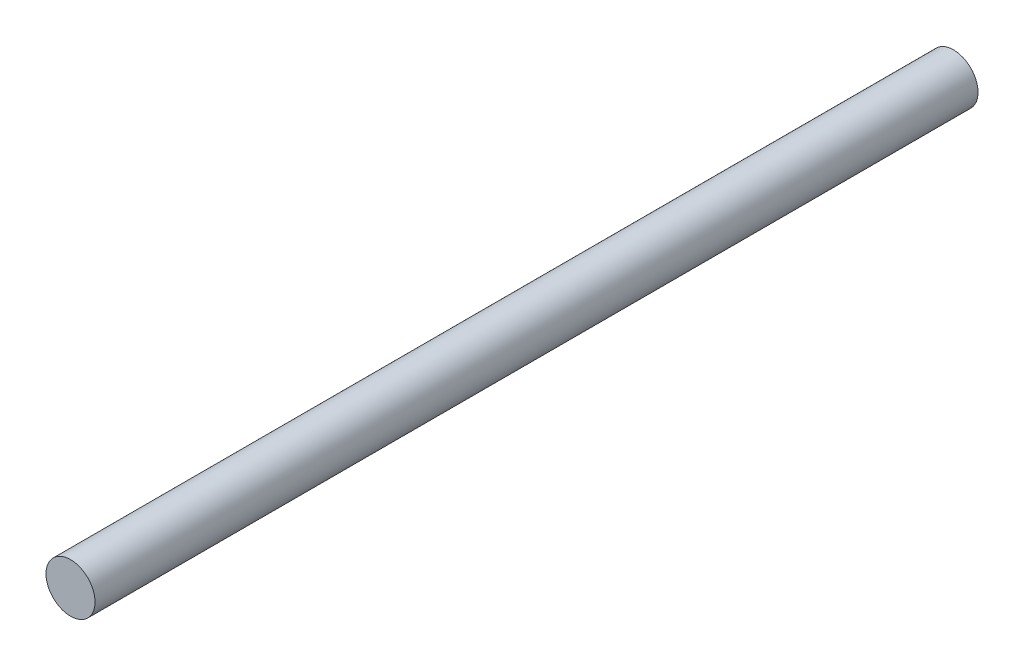
ISO-10303-21;
HEADER;
FILE_DESCRIPTION(('STEP AP214'),'2;1');
FILE_NAME('part.step','',(''),(''),'','','');
FILE_SCHEMA(('AUTOMOTIVE_DESIGN { 1 0 10303 214 1 1 1 1 }'));
ENDSEC;
DATA;
#1=APPLICATION_CONTEXT('core data for automotive mechanical design processes');
#2=APPLICATION_PROTOCOL_DEFINITION('international standard','automotive_design',2000,#1);
#3=PRODUCT_CONTEXT('',#1,'mechanical');
#4=PRODUCT('Part','Part','',(#3));
#5=PRODUCT_RELATED_PRODUCT_CATEGORY('part','',(#4));
#6=PRODUCT_DEFINITION_FORMATION('','',#4);
#7=PRODUCT_DEFINITION_CONTEXT('part definition',#1,'design');
#8=PRODUCT_DEFINITION('design','',#6,#7);
#9=PRODUCT_DEFINITION_SHAPE('','',#8);
#10=(LENGTH_UNIT() NAMED_UNIT(*) SI_UNIT(.MILLI.,.METRE.));
#11=(NAMED_UNIT(*) PLANE_ANGLE_UNIT() SI_UNIT($,.RADIAN.));
#12=(NAMED_UNIT(*) SI_UNIT($,.STERADIAN.) SOLID_ANGLE_UNIT());
#13=UNCERTAINTY_MEASURE_WITH_UNIT(LENGTH_MEASURE(1.E-05),#10,'distance_accuracy_value','');
#14=(GEOMETRIC_REPRESENTATION_CONTEXT(3) GLOBAL_UNCERTAINTY_ASSIGNED_CONTEXT((#13)) GLOBAL_UNIT_ASSIGNED_CONTEXT((#10,
#11,#12)) REPRESENTATION_CONTEXT('',''));
#15=CARTESIAN_POINT('',(0.,0.,0.));
#16=DIRECTION('',(0.,0.,1.));
#17=DIRECTION('',(1.,0.,0.));
#18=AXIS2_PLACEMENT_3D('',#15,#16,#17);
#19=CARTESIAN_POINT('',(0.,0.,180.));
#20=DIRECTION('',(0.,0.,-1.));
#21=DIRECTION('',(-1.,0.,0.));
#22=AXIS2_PLACEMENT_3D('',#19,#20,#21);
#23=CYLINDRICAL_SURFACE('',#22,5.);
#24=CARTESIAN_POINT('',(0.,0.,180.));
#25=DIRECTION('',(0.,0.,1.));
#26=DIRECTION('',(1.,0.,0.));
#27=AXIS2_PLACEMENT_3D('',#24,#25,#26);
#28=CIRCLE('',#27,5.);
#29=CARTESIAN_POINT('',(-5.,0.,180.));
#30=VERTEX_POINT('',#29);
#31=EDGE_CURVE('E10',#30,#30,#28,.T.);
#32=CARTESIAN_POINT('',(0.,0.,0.));
#33=DIRECTION('',(0.,0.,1.));
#34=DIRECTION('',(1.,0.,0.));
#35=AXIS2_PLACEMENT_3D('',#32,#33,#34);
#36=CIRCLE('',#35,5.);
#37=CARTESIAN_POINT('',(-5.,0.,0.));
#38=VERTEX_POINT('',#37);
#39=EDGE_CURVE('E40',#38,#38,#36,.T.);
#40=CARTESIAN_POINT('',(-5.,0.,180.));
#41=CARTESIAN_POINT('',(-5.,0.,178.125));
#42=CARTESIAN_POINT('',(-5.,0.,176.25));
#43=CARTESIAN_POINT('',(-5.,0.,172.5));
#44=CARTESIAN_POINT('',(-5.,0.,170.625));
#45=CARTESIAN_POINT('',(-5.,0.,166.875));
#46=CARTESIAN_POINT('',(-5.,0.,165.));
#47=CARTESIAN_POINT('',(-5.,0.,161.25));
#48=CARTESIAN_POINT('',(-5.,0.,159.375));
#49=CARTESIAN_POINT('',(-5.,0.,155.625));
#50=CARTESIAN_POINT('',(-5.,0.,153.75));
#51=CARTESIAN_POINT('',(-5.,0.,150.));
#52=CARTESIAN_POINT('',(-5.,0.,148.125));
#53=CARTESIAN_POINT('',(-5.,0.,144.375));
#54=CARTESIAN_POINT('',(-5.,0.,142.5));
#55=CARTESIAN_POINT('',(-5.,0.,138.75));
#56=CARTESIAN_POINT('',(-5.,0.,136.875));
#57=CARTESIAN_POINT('',(-5.,0.,133.125));
#58=CARTESIAN_POINT('',(-5.,0.,131.25));
#59=CARTESIAN_POINT('',(-5.,0.,127.5));
#60=CARTESIAN_POINT('',(-5.,0.,125.625));
#61=CARTESIAN_POINT('',(-5.,0.,121.875));
#62=CARTESIAN_POINT('',(-5.,0.,120.));
#63=CARTESIAN_POINT('',(-5.,0.,116.25));
#64=CARTESIAN_POINT('',(-5.,0.,114.375));
#65=CARTESIAN_POINT('',(-5.,0.,110.625));
#66=CARTESIAN_POINT('',(-5.,0.,108.75));
#67=CARTESIAN_POINT('',(-5.,0.,105.));
#68=CARTESIAN_POINT('',(-5.,0.,103.125));
#69=CARTESIAN_POINT('',(-5.,0.,99.375));
#70=CARTESIAN_POINT('',(-5.,0.,97.5));
#71=CARTESIAN_POINT('',(-5.,0.,93.75));
#72=CARTESIAN_POINT('',(-5.,0.,91.875));
#73=CARTESIAN_POINT('',(-5.,0.,88.125));
#74=CARTESIAN_POINT('',(-5.,0.,86.25));
#75=CARTESIAN_POINT('',(-5.,0.,82.5));
#76=CARTESIAN_POINT('',(-5.,0.,80.625));
#77=CARTESIAN_POINT('',(-5.,0.,76.875));
#78=CARTESIAN_POINT('',(-5.,0.,75.));
#79=CARTESIAN_POINT('',(-5.,0.,71.25));
#80=CARTESIAN_POINT('',(-5.,0.,69.375));
#81=CARTESIAN_POINT('',(-5.,0.,65.625));
#82=CARTESIAN_POINT('',(-5.,0.,63.75));
#83=CARTESIAN_POINT('',(-5.,0.,60.));
#84=CARTESIAN_POINT('',(-5.,0.,58.125));
#85=CARTESIAN_POINT('',(-5.,0.,54.375));
#86=CARTESIAN_POINT('',(-5.,0.,52.5));
#87=CARTESIAN_POINT('',(-5.,0.,48.75));
#88=CARTESIAN_POINT('',(-5.,0.,46.875));
#89=CARTESIAN_POINT('',(-5.,0.,43.125));
#90=CARTESIAN_POINT('',(-5.,0.,41.25));
#91=CARTESIAN_POINT('',(-5.,0.,37.5));
#92=CARTESIAN_POINT('',(-5.,0.,35.625));
#93=CARTESIAN_POINT('',(-5.,0.,31.875));
#94=CARTESIAN_POINT('',(-5.,0.,30.));
#95=CARTESIAN_POINT('',(-5.,0.,26.25));
#96=CARTESIAN_POINT('',(-5.,0.,24.375));
#97=CARTESIAN_POINT('',(-5.,0.,20.625));
#98=CARTESIAN_POINT('',(-5.,0.,18.75));
#99=CARTESIAN_POINT('',(-5.,0.,15.));
#100=CARTESIAN_POINT('',(-5.,0.,13.125));
#101=CARTESIAN_POINT('',(-5.,0.,9.37499999999998));
#102=CARTESIAN_POINT('',(-5.,0.,7.49999999999997));
#103=CARTESIAN_POINT('',(-5.,0.,3.74999999999997));
#104=CARTESIAN_POINT('',(-5.,0.,1.87499999999997));
#105=CARTESIAN_POINT('',(-5.,0.,0.));
#106=B_SPLINE_CURVE_WITH_KNOTS('',3,(#40,#41,#42,#43,#44,#45,#46,#47,#48,#49,#50,#51,#52,#53,
#54,#55,#56,#57,#58,#59,#60,#61,#62,#63,#64,#65,#66,#67,#68,#69,#70,#71,#72,#73,#74,#75,#76,#77,
#78,#79,#80,#81,#82,#83,#84,#85,#86,#87,#88,#89,#90,#91,#92,#93,#94,#95,#96,#97,#98,#99,#100,
#101,#102,#103,#104,#105),.UNSPECIFIED.,.F.,.F.,(4,2,2,2,2,2,2,2,2,2,2,2,2,2,2,2,2,2,2,2,2,2,2,
2,2,2,2,2,2,2,2,2,4),(0.,5.62500000000002,11.25,16.875,22.5,28.125,33.75,39.375,45.,50.625,
56.25,61.875,67.5,73.125,78.75,84.375,90.,95.625,101.25,106.875,112.5,118.125,123.75,129.375,
135.,140.625,146.25,151.875,157.5,163.125,168.75,174.375,180.),.UNSPECIFIED.);
#107=EDGE_CURVE('BSEAM37',#30,#38,#106,.T.);
#108=ORIENTED_EDGE('',*,*,#31,.F.);
#109=ORIENTED_EDGE('',*,*,#39,.T.);
#110=ORIENTED_EDGE('',*,*,#107,.T.);
#111=ORIENTED_EDGE('',*,*,#107,.F.);
#112=EDGE_LOOP('',(#108,#110,#109,#111));
#113=FACE_BOUND('',#112,.T.);
#114=ADVANCED_FACE('F37',(#113),#23,.T.);
#115=CARTESIAN_POINT('',(0.,0.,180.));
#116=DIRECTION('',(0.,0.,1.));
#117=DIRECTION('',(1.,0.,0.));
#118=AXIS2_PLACEMENT_3D('',#115,#116,#117);
#119=PLANE('',#118);
#120=ORIENTED_EDGE('',*,*,#31,.T.);
#121=EDGE_LOOP('',(#120));
#122=FACE_BOUND('',#121,.T.);
#123=ADVANCED_FACE('F52',(#122),#119,.T.);
#124=CARTESIAN_POINT('',(0.,0.,0.));
#125=DIRECTION('',(0.,0.,1.));
#126=DIRECTION('',(1.,0.,0.));
#127=AXIS2_PLACEMENT_3D('',#124,#125,#126);
#128=PLANE('',#127);
#129=ORIENTED_EDGE('',*,*,#39,.F.);
#130=EDGE_LOOP('',(#129));
#131=FACE_BOUND('',#130,.T.);
#132=ADVANCED_FACE('F50',(#131),#128,.F.);
#133=CLOSED_SHELL('',(#114,#123,#132));
#134=MANIFOLD_SOLID_BREP('B2',#133);
#135=ADVANCED_BREP_SHAPE_REPRESENTATION('',(#18,#134),#14);
#136=SHAPE_DEFINITION_REPRESENTATION(#9,#135);
ENDSEC;
END-ISO-10303-21;
